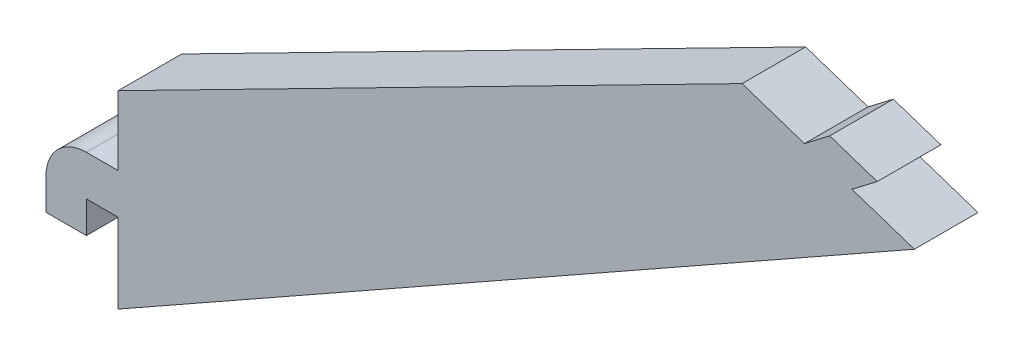
ISO-10303-21;
HEADER;
FILE_DESCRIPTION(('STEP AP214'),'2;1');
FILE_NAME('part.step','',(''),(''),'','','');
FILE_SCHEMA(('AUTOMOTIVE_DESIGN { 1 0 10303 214 1 1 1 1 }'));
ENDSEC;
DATA;
#1=APPLICATION_CONTEXT('core data for automotive mechanical design processes');
#2=APPLICATION_PROTOCOL_DEFINITION('international standard','automotive_design',2000,#1);
#3=PRODUCT_CONTEXT('',#1,'mechanical');
#4=PRODUCT('Part','Part','',(#3));
#5=PRODUCT_RELATED_PRODUCT_CATEGORY('part','',(#4));
#6=PRODUCT_DEFINITION_FORMATION('','',#4);
#7=PRODUCT_DEFINITION_CONTEXT('part definition',#1,'design');
#8=PRODUCT_DEFINITION('design','',#6,#7);
#9=PRODUCT_DEFINITION_SHAPE('','',#8);
#10=(LENGTH_UNIT() NAMED_UNIT(*) SI_UNIT(.MILLI.,.METRE.));
#11=(NAMED_UNIT(*) PLANE_ANGLE_UNIT() SI_UNIT($,.RADIAN.));
#12=(NAMED_UNIT(*) SI_UNIT($,.STERADIAN.) SOLID_ANGLE_UNIT());
#13=UNCERTAINTY_MEASURE_WITH_UNIT(LENGTH_MEASURE(1.E-05),#10,'distance_accuracy_value','');
#14=(GEOMETRIC_REPRESENTATION_CONTEXT(3) GLOBAL_UNCERTAINTY_ASSIGNED_CONTEXT((#13)) GLOBAL_UNIT_ASSIGNED_CONTEXT((#10,
#11,#12)) REPRESENTATION_CONTEXT('',''));
#15=CARTESIAN_POINT('',(0.,0.,0.));
#16=DIRECTION('',(0.,0.,1.));
#17=DIRECTION('',(1.,0.,0.));
#18=AXIS2_PLACEMENT_3D('',#15,#16,#17);
#19=CARTESIAN_POINT('',(-65.6226941993977,-4.16341339021471,6.35));
#20=DIRECTION('',(0.,0.,-1.));
#21=DIRECTION('',(-1.,0.,0.));
#22=AXIS2_PLACEMENT_3D('',#19,#20,#21);
#23=CYLINDRICAL_SURFACE('',#22,4.0323008);
#24=CARTESIAN_POINT('',(-65.6226941993977,-4.16341339021471,0.));
#25=DIRECTION('',(0.,0.,1.));
#26=DIRECTION('',(1.,0.,0.));
#27=AXIS2_PLACEMENT_3D('',#24,#25,#26);
#28=CIRCLE('',#27,4.0323008);
#29=CARTESIAN_POINT('',(-69.6549949993977,-4.16341339021471,0.));
#30=VERTEX_POINT('',#29);
#31=CARTESIAN_POINT('',(-65.6226941993978,-0.131112590214706,0.));
#32=VERTEX_POINT('',#31);
#33=EDGE_CURVE('E176',#30,#32,#28,.F.);
#34=ORIENTED_EDGE('',*,*,#33,.F.);
#35=DIRECTION('',(0.,0.,-1.));
#36=VECTOR('',#35,1.);
#37=CARTESIAN_POINT('',(-69.6549949993977,-4.16341339021471,6.35));
#38=LINE('',#37,#36);
#39=CARTESIAN_POINT('',(-69.6549949993977,-4.16341339021471,6.35));
#40=VERTEX_POINT('',#39);
#41=EDGE_CURVE('E11',#40,#30,#38,.T.);
#42=ORIENTED_EDGE('',*,*,#41,.F.);
#43=CARTESIAN_POINT('',(-65.6226941993977,-4.16341339021471,6.35));
#44=DIRECTION('',(0.,0.,1.));
#45=DIRECTION('',(1.,0.,0.));
#46=AXIS2_PLACEMENT_3D('',#43,#44,#45);
#47=CIRCLE('',#46,4.0323008);
#48=CARTESIAN_POINT('',(-65.6226941993978,-0.131112590214706,6.35));
#49=VERTEX_POINT('',#48);
#50=EDGE_CURVE('E216',#40,#49,#47,.F.);
#51=ORIENTED_EDGE('',*,*,#50,.T.);
#52=DIRECTION('',(0.,0.,-1.));
#53=VECTOR('',#52,1.);
#54=CARTESIAN_POINT('',(-65.6226941993978,-0.131112590214706,6.35));
#55=LINE('',#54,#53);
#56=EDGE_CURVE('E57',#49,#32,#55,.T.);
#57=ORIENTED_EDGE('',*,*,#56,.T.);
#58=EDGE_LOOP('',(#34,#42,#51,#57));
#59=FACE_BOUND('',#58,.T.);
#60=ADVANCED_FACE('F41',(#59),#23,.T.);
#61=CARTESIAN_POINT('',(-69.6549949993977,0.,6.35));
#62=DIRECTION('',(-1.,0.,0.));
#63=DIRECTION('',(0.,0.,1.));
#64=AXIS2_PLACEMENT_3D('',#61,#62,#63);
#65=PLANE('',#64);
#66=DIRECTION('',(0.,1.,0.));
#67=VECTOR('',#66,1.);
#68=CARTESIAN_POINT('',(-69.6549949993977,0.,0.));
#69=LINE('',#68,#67);
#70=CARTESIAN_POINT('',(-69.6549949993977,-7.33841339021471,0.));
#71=VERTEX_POINT('',#70);
#72=EDGE_CURVE('E178',#71,#30,#69,.T.);
#73=ORIENTED_EDGE('',*,*,#72,.F.);
#74=DIRECTION('',(0.,0.,-1.));
#75=VECTOR('',#74,1.);
#76=CARTESIAN_POINT('',(-69.6549949993977,-7.33841339021471,6.35));
#77=LINE('',#76,#75);
#78=CARTESIAN_POINT('',(-69.6549949993977,-7.33841339021471,6.35));
#79=VERTEX_POINT('',#78);
#80=EDGE_CURVE('E49',#79,#71,#77,.T.);
#81=ORIENTED_EDGE('',*,*,#80,.F.);
#82=DIRECTION('',(0.,1.,0.));
#83=VECTOR('',#82,1.);
#84=CARTESIAN_POINT('',(-69.6549949993977,0.,6.35));
#85=LINE('',#84,#83);
#86=EDGE_CURVE('E261',#79,#40,#85,.T.);
#87=ORIENTED_EDGE('',*,*,#86,.T.);
#88=ORIENTED_EDGE('',*,*,#41,.T.);
#89=EDGE_LOOP('',(#73,#81,#87,#88));
#90=FACE_BOUND('',#89,.T.);
#91=ADVANCED_FACE('F248',(#90),#65,.T.);
#92=CARTESIAN_POINT('',(0.,-7.33841339021471,6.35));
#93=DIRECTION('',(0.,-1.,0.));
#94=DIRECTION('',(0.,0.,-1.));
#95=AXIS2_PLACEMENT_3D('',#92,#93,#94);
#96=PLANE('',#95);
#97=DIRECTION('',(-1.,0.,0.));
#98=VECTOR('',#97,1.);
#99=CARTESIAN_POINT('',(0.,-7.33841339021471,0.));
#100=LINE('',#99,#98);
#101=CARTESIAN_POINT('',(-65.6226941993977,-7.33841339021471,0.));
#102=VERTEX_POINT('',#101);
#103=EDGE_CURVE('E181',#102,#71,#100,.T.);
#104=ORIENTED_EDGE('',*,*,#103,.F.);
#105=DIRECTION('',(0.,0.,-1.));
#106=VECTOR('',#105,1.);
#107=CARTESIAN_POINT('',(-65.6226941993977,-7.33841339021471,6.35));
#108=LINE('',#107,#106);
#109=CARTESIAN_POINT('',(-65.6226941993977,-7.33841339021471,6.35));
#110=VERTEX_POINT('',#109);
#111=EDGE_CURVE('E237',#110,#102,#108,.T.);
#112=ORIENTED_EDGE('',*,*,#111,.F.);
#113=DIRECTION('',(-1.,0.,0.));
#114=VECTOR('',#113,1.);
#115=CARTESIAN_POINT('',(0.,-7.33841339021471,6.35));
#116=LINE('',#115,#114);
#117=EDGE_CURVE('E244',#110,#79,#116,.T.);
#118=ORIENTED_EDGE('',*,*,#117,.T.);
#119=ORIENTED_EDGE('',*,*,#80,.T.);
#120=EDGE_LOOP('',(#104,#112,#118,#119));
#121=FACE_BOUND('',#120,.T.);
#122=ADVANCED_FACE('F242',(#121),#96,.T.);
#123=CARTESIAN_POINT('',(-65.6226941993977,0.,6.35));
#124=DIRECTION('',(1.,0.,0.));
#125=DIRECTION('',(0.,0.,-1.));
#126=AXIS2_PLACEMENT_3D('',#123,#124,#125);
#127=PLANE('',#126);
#128=DIRECTION('',(0.,-1.,0.));
#129=VECTOR('',#128,1.);
#130=CARTESIAN_POINT('',(-65.6226941993977,0.,0.));
#131=LINE('',#130,#129);
#132=CARTESIAN_POINT('',(-65.6226941993977,-4.16341339021471,0.));
#133=VERTEX_POINT('',#132);
#134=EDGE_CURVE('E184',#133,#102,#131,.T.);
#135=ORIENTED_EDGE('',*,*,#134,.F.);
#136=DIRECTION('',(0.,0.,-1.));
#137=VECTOR('',#136,1.);
#138=CARTESIAN_POINT('',(-65.6226941993977,-4.16341339021471,6.35));
#139=LINE('',#138,#137);
#140=CARTESIAN_POINT('',(-65.6226941993977,-4.16341339021471,6.35));
#141=VERTEX_POINT('',#140);
#142=EDGE_CURVE('E235',#141,#133,#139,.T.);
#143=ORIENTED_EDGE('',*,*,#142,.F.);
#144=DIRECTION('',(0.,-1.,0.));
#145=VECTOR('',#144,1.);
#146=CARTESIAN_POINT('',(-65.6226941993977,0.,6.35));
#147=LINE('',#146,#145);
#148=EDGE_CURVE('E258',#141,#110,#147,.T.);
#149=ORIENTED_EDGE('',*,*,#148,.T.);
#150=ORIENTED_EDGE('',*,*,#111,.T.);
#151=EDGE_LOOP('',(#135,#143,#149,#150));
#152=FACE_BOUND('',#151,.T.);
#153=ADVANCED_FACE('F255',(#152),#127,.T.);
#154=CARTESIAN_POINT('',(0.,-4.16341339021471,6.35));
#155=DIRECTION('',(0.,-1.,0.));
#156=DIRECTION('',(0.,0.,-1.));
#157=AXIS2_PLACEMENT_3D('',#154,#155,#156);
#158=PLANE('',#157);
#159=DIRECTION('',(-1.,0.,0.));
#160=VECTOR('',#159,1.);
#161=CARTESIAN_POINT('',(0.,-4.16341339021471,0.));
#162=LINE('',#161,#160);
#163=CARTESIAN_POINT('',(-62.4476941993978,-4.16341339021471,0.));
#164=VERTEX_POINT('',#163);
#165=EDGE_CURVE('E187',#164,#133,#162,.T.);
#166=ORIENTED_EDGE('',*,*,#165,.F.);
#167=DIRECTION('',(0.,0.,-1.));
#168=VECTOR('',#167,1.);
#169=CARTESIAN_POINT('',(-62.4476941993978,-4.16341339021471,6.35));
#170=LINE('',#169,#168);
#171=CARTESIAN_POINT('',(-62.4476941993978,-4.16341339021471,6.35));
#172=VERTEX_POINT('',#171);
#173=EDGE_CURVE('E233',#172,#164,#170,.T.);
#174=ORIENTED_EDGE('',*,*,#173,.F.);
#175=DIRECTION('',(-1.,0.,0.));
#176=VECTOR('',#175,1.);
#177=CARTESIAN_POINT('',(0.,-4.16341339021471,6.35));
#178=LINE('',#177,#176);
#179=EDGE_CURVE('E263',#172,#141,#178,.T.);
#180=ORIENTED_EDGE('',*,*,#179,.T.);
#181=ORIENTED_EDGE('',*,*,#142,.T.);
#182=EDGE_LOOP('',(#166,#174,#180,#181));
#183=FACE_BOUND('',#182,.T.);
#184=ADVANCED_FACE('F309',(#183),#158,.T.);
#185=CARTESIAN_POINT('',(-62.4476941993978,0.,6.35));
#186=DIRECTION('',(1.,0.,0.));
#187=DIRECTION('',(0.,0.,-1.));
#188=AXIS2_PLACEMENT_3D('',#185,#186,#187);
#189=PLANE('',#188);
#190=DIRECTION('',(0.,-1.,0.));
#191=VECTOR('',#190,1.);
#192=CARTESIAN_POINT('',(-62.4476941993978,0.,0.));
#193=LINE('',#192,#191);
#194=CARTESIAN_POINT('',(-62.4476941993978,-12.1077047697668,0.));
#195=VERTEX_POINT('',#194);
#196=EDGE_CURVE('E190',#164,#195,#193,.T.);
#197=ORIENTED_EDGE('',*,*,#196,.T.);
#198=DIRECTION('',(0.,0.,-1.));
#199=VECTOR('',#198,1.);
#200=CARTESIAN_POINT('',(-62.4476941993978,-12.1077047697668,6.35));
#201=LINE('',#200,#199);
#202=CARTESIAN_POINT('',(-62.4476941993978,-12.1077047697668,6.35));
#203=VERTEX_POINT('',#202);
#204=EDGE_CURVE('E230',#203,#195,#201,.T.);
#205=ORIENTED_EDGE('',*,*,#204,.F.);
#206=DIRECTION('',(0.,-1.,0.));
#207=VECTOR('',#206,1.);
#208=CARTESIAN_POINT('',(-62.4476941993978,0.,6.35));
#209=LINE('',#208,#207);
#210=EDGE_CURVE('E269',#172,#203,#209,.T.);
#211=ORIENTED_EDGE('',*,*,#210,.F.);
#212=ORIENTED_EDGE('',*,*,#173,.T.);
#213=EDGE_LOOP('',(#197,#205,#211,#212));
#214=FACE_BOUND('',#213,.T.);
#215=ADVANCED_FACE('F312',(#214),#189,.F.);
#216=CARTESIAN_POINT('',(-9.92920066728216,17.5706219949138,6.35));
#217=DIRECTION('',(-0.491981382202654,0.870605719924907,0.));
#218=DIRECTION('',(-0.870605719924907,-0.491981382202654,0.));
#219=AXIS2_PLACEMENT_3D('',#216,#217,#218);
#220=PLANE('',#219);
#221=DIRECTION('',(0.870605719924907,0.491981382202654,0.));
#222=VECTOR('',#221,1.);
#223=CARTESIAN_POINT('',(-9.92920066728216,17.5706219949138,0.));
#224=LINE('',#223,#222);
#225=CARTESIAN_POINT('',(17.0563587289375,32.8202263880588,0.));
#226=VERTEX_POINT('',#225);
#227=EDGE_CURVE('E192',#195,#226,#224,.T.);
#228=ORIENTED_EDGE('',*,*,#227,.T.);
#229=DIRECTION('',(0.,0.,-1.));
#230=VECTOR('',#229,1.);
#231=CARTESIAN_POINT('',(17.0563587289375,32.8202263880588,6.35));
#232=LINE('',#231,#230);
#233=CARTESIAN_POINT('',(17.0563587289375,32.8202263880588,6.35));
#234=VERTEX_POINT('',#233);
#235=EDGE_CURVE('E228',#234,#226,#232,.T.);
#236=ORIENTED_EDGE('',*,*,#235,.F.);
#237=DIRECTION('',(0.870605719924907,0.491981382202654,0.));
#238=VECTOR('',#237,1.);
#239=CARTESIAN_POINT('',(-9.92920066728216,17.5706219949138,6.35));
#240=LINE('',#239,#238);
#241=EDGE_CURVE('E271',#203,#234,#240,.T.);
#242=ORIENTED_EDGE('',*,*,#241,.F.);
#243=ORIENTED_EDGE('',*,*,#204,.T.);
#244=EDGE_LOOP('',(#228,#236,#242,#243));
#245=FACE_BOUND('',#244,.T.);
#246=ADVANCED_FACE('F316',(#245),#220,.F.);
#247=CARTESIAN_POINT('',(11.523536235453,34.6597569036708,6.35));
#248=DIRECTION('',(0.31549545255864,0.94892708856625,0.));
#249=DIRECTION('',(-0.94892708856625,0.31549545255864,0.));
#250=AXIS2_PLACEMENT_3D('',#247,#248,#249);
#251=PLANE('',#250);
#252=DIRECTION('',(0.94892708856625,-0.31549545255864,0.));
#253=VECTOR('',#252,1.);
#254=CARTESIAN_POINT('',(11.523536235453,34.6597569036708,0.));
#255=LINE('',#254,#253);
#256=CARTESIAN_POINT('',(10.8255546057863,34.8918190218068,0.));
#257=VERTEX_POINT('',#256);
#258=EDGE_CURVE('E195',#257,#226,#255,.T.);
#259=ORIENTED_EDGE('',*,*,#258,.F.);
#260=DIRECTION('',(0.,0.,-1.));
#261=VECTOR('',#260,1.);
#262=CARTESIAN_POINT('',(10.8255546057863,34.8918190218068,6.35));
#263=LINE('',#262,#261);
#264=CARTESIAN_POINT('',(10.8255546057863,34.8918190218068,6.35));
#265=VERTEX_POINT('',#264);
#266=EDGE_CURVE('E226',#265,#257,#263,.T.);
#267=ORIENTED_EDGE('',*,*,#266,.F.);
#268=DIRECTION('',(0.94892708856625,-0.31549545255864,0.));
#269=VECTOR('',#268,1.);
#270=CARTESIAN_POINT('',(11.523536235453,34.6597569036708,6.35));
#271=LINE('',#270,#269);
#272=EDGE_CURVE('E273',#265,#234,#271,.T.);
#273=ORIENTED_EDGE('',*,*,#272,.T.);
#274=ORIENTED_EDGE('',*,*,#235,.T.);
#275=EDGE_LOOP('',(#259,#267,#273,#274));
#276=FACE_BOUND('',#275,.T.);
#277=ADVANCED_FACE('F320',(#276),#251,.T.);
#278=CARTESIAN_POINT('',(-12.8413695559847,16.7795468109685,6.35));
#279=DIRECTION('',(0.607747251155393,-0.794130517429638,0.));
#280=DIRECTION('',(0.794130517429638,0.607747251155393,0.));
#281=AXIS2_PLACEMENT_3D('',#278,#279,#280);
#282=PLANE('',#281);
#283=DIRECTION('',(-0.794130517429638,-0.607747251155393,0.));
#284=VECTOR('',#283,1.);
#285=CARTESIAN_POINT('',(-12.8413695559847,16.7795468109685,0.));
#286=LINE('',#285,#284);
#287=CARTESIAN_POINT('',(13.3469189986254,36.8214165442252,0.));
#288=VERTEX_POINT('',#287);
#289=EDGE_CURVE('E198',#288,#257,#286,.T.);
#290=ORIENTED_EDGE('',*,*,#289,.F.);
#291=DIRECTION('',(0.,0.,-1.));
#292=VECTOR('',#291,1.);
#293=CARTESIAN_POINT('',(13.3469189986254,36.8214165442252,6.35));
#294=LINE('',#293,#292);
#295=CARTESIAN_POINT('',(13.3469189986254,36.8214165442252,6.35));
#296=VERTEX_POINT('',#295);
#297=EDGE_CURVE('E224',#296,#288,#294,.T.);
#298=ORIENTED_EDGE('',*,*,#297,.F.);
#299=DIRECTION('',(-0.794130517429638,-0.607747251155393,0.));
#300=VECTOR('',#299,1.);
#301=CARTESIAN_POINT('',(-12.8413695559847,16.7795468109685,6.35));
#302=LINE('',#301,#300);
#303=EDGE_CURVE('E276',#296,#265,#302,.T.);
#304=ORIENTED_EDGE('',*,*,#303,.T.);
#305=ORIENTED_EDGE('',*,*,#266,.T.);
#306=EDGE_LOOP('',(#290,#298,#304,#305));
#307=FACE_BOUND('',#306,.T.);
#308=ADVANCED_FACE('F324',(#307),#282,.T.);
#309=CARTESIAN_POINT('',(12.3521933578177,37.1521389147842,6.35));
#310=DIRECTION('',(0.315495452558639,0.94892708856625,0.));
#311=DIRECTION('',(-0.94892708856625,0.315495452558639,0.));
#312=AXIS2_PLACEMENT_3D('',#309,#310,#311);
#313=PLANE('',#312);
#314=DIRECTION('',(0.94892708856625,-0.315495452558639,0.));
#315=VECTOR('',#314,1.);
#316=CARTESIAN_POINT('',(12.3521933578177,37.1521389147842,0.));
#317=LINE('',#316,#315);
#318=CARTESIAN_POINT('',(8.6022835557941,38.3988938070184,0.));
#319=VERTEX_POINT('',#318);
#320=EDGE_CURVE('E201',#319,#288,#317,.T.);
#321=ORIENTED_EDGE('',*,*,#320,.F.);
#322=DIRECTION('',(0.,0.,-1.));
#323=VECTOR('',#322,1.);
#324=CARTESIAN_POINT('',(8.6022835557941,38.3988938070184,6.35));
#325=LINE('',#324,#323);
#326=CARTESIAN_POINT('',(8.6022835557941,38.3988938070184,6.35));
#327=VERTEX_POINT('',#326);
#328=EDGE_CURVE('E222',#327,#319,#325,.T.);
#329=ORIENTED_EDGE('',*,*,#328,.F.);
#330=DIRECTION('',(0.94892708856625,-0.315495452558639,0.));
#331=VECTOR('',#330,1.);
#332=CARTESIAN_POINT('',(12.3521933578177,37.1521389147842,6.35));
#333=LINE('',#332,#331);
#334=EDGE_CURVE('E279',#327,#296,#333,.T.);
#335=ORIENTED_EDGE('',*,*,#334,.T.);
#336=ORIENTED_EDGE('',*,*,#297,.T.);
#337=EDGE_LOOP('',(#321,#329,#335,#336));
#338=FACE_BOUND('',#337,.T.);
#339=ADVANCED_FACE('F328',(#338),#313,.T.);
#340=CARTESIAN_POINT('',(-15.3551714062423,20.064278679793,6.35));
#341=DIRECTION('',(-0.607747251155393,0.794130517429637,0.));
#342=DIRECTION('',(-0.794130517429637,-0.607747251155394,0.));
#343=AXIS2_PLACEMENT_3D('',#340,#341,#342);
#344=PLANE('',#343);
#345=DIRECTION('',(0.794130517429637,0.607747251155394,0.));
#346=VECTOR('',#345,1.);
#347=CARTESIAN_POINT('',(-15.3551714062423,20.064278679793,0.));
#348=LINE('',#347,#346);
#349=CARTESIAN_POINT('',(6.08091916295501,36.4692962846,0.));
#350=VERTEX_POINT('',#349);
#351=EDGE_CURVE('E204',#350,#319,#348,.T.);
#352=ORIENTED_EDGE('',*,*,#351,.F.);
#353=DIRECTION('',(0.,0.,-1.));
#354=VECTOR('',#353,1.);
#355=CARTESIAN_POINT('',(6.08091916295501,36.4692962846,6.35));
#356=LINE('',#355,#354);
#357=CARTESIAN_POINT('',(6.08091916295501,36.4692962846,6.35));
#358=VERTEX_POINT('',#357);
#359=EDGE_CURVE('E220',#358,#350,#356,.T.);
#360=ORIENTED_EDGE('',*,*,#359,.F.);
#361=DIRECTION('',(0.794130517429637,0.607747251155394,0.));
#362=VECTOR('',#361,1.);
#363=CARTESIAN_POINT('',(-15.3551714062423,20.064278679793,6.35));
#364=LINE('',#363,#362);
#365=EDGE_CURVE('E282',#358,#327,#364,.T.);
#366=ORIENTED_EDGE('',*,*,#365,.T.);
#367=ORIENTED_EDGE('',*,*,#328,.T.);
#368=EDGE_LOOP('',(#352,#360,#366,#367));
#369=FACE_BOUND('',#368,.T.);
#370=ADVANCED_FACE('F332',(#369),#344,.T.);
#371=CARTESIAN_POINT('',(11.5235362354529,34.6597569036708,6.35));
#372=DIRECTION('',(0.315495452558639,0.94892708856625,0.));
#373=DIRECTION('',(-0.94892708856625,0.315495452558639,0.));
#374=AXIS2_PLACEMENT_3D('',#371,#372,#373);
#375=PLANE('',#374);
#376=DIRECTION('',(0.94892708856625,-0.315495452558639,0.));
#377=VECTOR('',#376,1.);
#378=CARTESIAN_POINT('',(11.5235362354529,34.6597569036708,0.));
#379=LINE('',#378,#377);
#380=CARTESIAN_POINT('',(-0.149884960196269,38.5408889183481,0.));
#381=VERTEX_POINT('',#380);
#382=EDGE_CURVE('E207',#381,#350,#379,.T.);
#383=ORIENTED_EDGE('',*,*,#382,.F.);
#384=DIRECTION('',(0.,0.,-1.));
#385=VECTOR('',#384,1.);
#386=CARTESIAN_POINT('',(-0.149884960196269,38.5408889183481,6.35));
#387=LINE('',#386,#385);
#388=CARTESIAN_POINT('',(-0.149884960196269,38.5408889183481,6.35));
#389=VERTEX_POINT('',#388);
#390=EDGE_CURVE('E168',#389,#381,#387,.T.);
#391=ORIENTED_EDGE('',*,*,#390,.F.);
#392=DIRECTION('',(0.94892708856625,-0.315495452558639,0.));
#393=VECTOR('',#392,1.);
#394=CARTESIAN_POINT('',(11.5235362354529,34.6597569036708,6.35));
#395=LINE('',#394,#393);
#396=EDGE_CURVE('E158',#389,#358,#395,.T.);
#397=ORIENTED_EDGE('',*,*,#396,.T.);
#398=ORIENTED_EDGE('',*,*,#359,.T.);
#399=EDGE_LOOP('',(#383,#391,#397,#398));
#400=FACE_BOUND('',#399,.T.);
#401=ADVANCED_FACE('F286',(#400),#375,.T.);
#402=CARTESIAN_POINT('',(-15.626142002394,30.6509470599901,6.35));
#403=DIRECTION('',(0.454191346098469,-0.890904159339971,0.));
#404=DIRECTION('',(0.890904159339971,0.454191346098469,0.));
#405=AXIS2_PLACEMENT_3D('',#402,#403,#404);
#406=PLANE('',#405);
#407=DIRECTION('',(-0.890904159339971,-0.454191346098469,0.));
#408=VECTOR('',#407,1.);
#409=CARTESIAN_POINT('',(-15.626142002394,30.6509470599901,0.));
#410=LINE('',#409,#408);
#411=CARTESIAN_POINT('',(-62.4476941993978,6.78087798933742,0.));
#412=VERTEX_POINT('',#411);
#413=EDGE_CURVE('E165',#381,#412,#410,.T.);
#414=ORIENTED_EDGE('',*,*,#413,.T.);
#415=DIRECTION('',(0.,0.,-1.));
#416=VECTOR('',#415,1.);
#417=CARTESIAN_POINT('',(-62.4476941993978,6.78087798933742,6.35));
#418=LINE('',#417,#416);
#419=CARTESIAN_POINT('',(-62.4476941993978,6.78087798933742,6.35));
#420=VERTEX_POINT('',#419);
#421=EDGE_CURVE('E162',#420,#412,#418,.T.);
#422=ORIENTED_EDGE('',*,*,#421,.F.);
#423=DIRECTION('',(-0.890904159339971,-0.454191346098469,0.));
#424=VECTOR('',#423,1.);
#425=CARTESIAN_POINT('',(-15.626142002394,30.6509470599901,6.35));
#426=LINE('',#425,#424);
#427=EDGE_CURVE('E150',#389,#420,#426,.T.);
#428=ORIENTED_EDGE('',*,*,#427,.F.);
#429=ORIENTED_EDGE('',*,*,#390,.T.);
#430=EDGE_LOOP('',(#414,#422,#428,#429));
#431=FACE_BOUND('',#430,.T.);
#432=ADVANCED_FACE('F163',(#431),#406,.F.);
#433=CARTESIAN_POINT('',(-62.4476941993978,0.,6.35));
#434=DIRECTION('',(1.,0.,0.));
#435=DIRECTION('',(0.,0.,-1.));
#436=AXIS2_PLACEMENT_3D('',#433,#434,#435);
#437=PLANE('',#436);
#438=DIRECTION('',(0.,-1.,0.));
#439=VECTOR('',#438,1.);
#440=CARTESIAN_POINT('',(-62.4476941993978,0.,0.));
#441=LINE('',#440,#439);
#442=CARTESIAN_POINT('',(-62.4476941993978,-0.131112590214706,0.));
#443=VERTEX_POINT('',#442);
#444=EDGE_CURVE('E211',#412,#443,#441,.T.);
#445=ORIENTED_EDGE('',*,*,#444,.T.);
#446=DIRECTION('',(0.,0.,-1.));
#447=VECTOR('',#446,1.);
#448=CARTESIAN_POINT('',(-62.4476941993978,-0.131112590214706,6.35));
#449=LINE('',#448,#447);
#450=CARTESIAN_POINT('',(-62.4476941993978,-0.131112590214706,6.35));
#451=VERTEX_POINT('',#450);
#452=EDGE_CURVE('E104',#451,#443,#449,.T.);
#453=ORIENTED_EDGE('',*,*,#452,.F.);
#454=DIRECTION('',(0.,-1.,0.));
#455=VECTOR('',#454,1.);
#456=CARTESIAN_POINT('',(-62.4476941993978,0.,6.35));
#457=LINE('',#456,#455);
#458=EDGE_CURVE('E155',#420,#451,#457,.T.);
#459=ORIENTED_EDGE('',*,*,#458,.F.);
#460=ORIENTED_EDGE('',*,*,#421,.T.);
#461=EDGE_LOOP('',(#445,#453,#459,#460));
#462=FACE_BOUND('',#461,.T.);
#463=ADVANCED_FACE('F170',(#462),#437,.F.);
#464=CARTESIAN_POINT('',(0.,-0.131112590214706,6.35));
#465=DIRECTION('',(0.,1.,0.));
#466=DIRECTION('',(0.,0.,1.));
#467=AXIS2_PLACEMENT_3D('',#464,#465,#466);
#468=PLANE('',#467);
#469=DIRECTION('',(1.,0.,0.));
#470=VECTOR('',#469,1.);
#471=CARTESIAN_POINT('',(0.,-0.131112590214706,0.));
#472=LINE('',#471,#470);
#473=EDGE_CURVE('E213',#32,#443,#472,.T.);
#474=ORIENTED_EDGE('',*,*,#473,.F.);
#475=ORIENTED_EDGE('',*,*,#56,.F.);
#476=DIRECTION('',(1.,0.,0.));
#477=VECTOR('',#476,1.);
#478=CARTESIAN_POINT('',(0.,-0.131112590214706,6.35));
#479=LINE('',#478,#477);
#480=EDGE_CURVE('E171',#49,#451,#479,.T.);
#481=ORIENTED_EDGE('',*,*,#480,.T.);
#482=ORIENTED_EDGE('',*,*,#452,.T.);
#483=EDGE_LOOP('',(#474,#475,#481,#482));
#484=FACE_BOUND('',#483,.T.);
#485=ADVANCED_FACE('F288',(#484),#468,.T.);
#486=CARTESIAN_POINT('',(0.,0.,6.35));
#487=DIRECTION('',(0.,0.,1.));
#488=DIRECTION('',(1.,0.,0.));
#489=AXIS2_PLACEMENT_3D('',#486,#487,#488);
#490=PLANE('',#489);
#491=ORIENTED_EDGE('',*,*,#50,.F.);
#492=ORIENTED_EDGE('',*,*,#86,.F.);
#493=ORIENTED_EDGE('',*,*,#117,.F.);
#494=ORIENTED_EDGE('',*,*,#148,.F.);
#495=ORIENTED_EDGE('',*,*,#179,.F.);
#496=ORIENTED_EDGE('',*,*,#210,.T.);
#497=ORIENTED_EDGE('',*,*,#241,.T.);
#498=ORIENTED_EDGE('',*,*,#272,.F.);
#499=ORIENTED_EDGE('',*,*,#303,.F.);
#500=ORIENTED_EDGE('',*,*,#334,.F.);
#501=ORIENTED_EDGE('',*,*,#365,.F.);
#502=ORIENTED_EDGE('',*,*,#396,.F.);
#503=ORIENTED_EDGE('',*,*,#427,.T.);
#504=ORIENTED_EDGE('',*,*,#458,.T.);
#505=ORIENTED_EDGE('',*,*,#480,.F.);
#506=EDGE_LOOP('',(#491,#492,#493,#494,#495,#496,#497,#498,#499,#500,#501,#502,#503,#504,#505));
#507=FACE_BOUND('',#506,.T.);
#508=ADVANCED_FACE('F152',(#507),#490,.T.);
#509=CARTESIAN_POINT('',(0.,0.,0.));
#510=DIRECTION('',(0.,0.,1.));
#511=DIRECTION('',(1.,0.,0.));
#512=AXIS2_PLACEMENT_3D('',#509,#510,#511);
#513=PLANE('',#512);
#514=ORIENTED_EDGE('',*,*,#33,.T.);
#515=ORIENTED_EDGE('',*,*,#473,.T.);
#516=ORIENTED_EDGE('',*,*,#444,.F.);
#517=ORIENTED_EDGE('',*,*,#413,.F.);
#518=ORIENTED_EDGE('',*,*,#382,.T.);
#519=ORIENTED_EDGE('',*,*,#351,.T.);
#520=ORIENTED_EDGE('',*,*,#320,.T.);
#521=ORIENTED_EDGE('',*,*,#289,.T.);
#522=ORIENTED_EDGE('',*,*,#258,.T.);
#523=ORIENTED_EDGE('',*,*,#227,.F.);
#524=ORIENTED_EDGE('',*,*,#196,.F.);
#525=ORIENTED_EDGE('',*,*,#165,.T.);
#526=ORIENTED_EDGE('',*,*,#134,.T.);
#527=ORIENTED_EDGE('',*,*,#103,.T.);
#528=ORIENTED_EDGE('',*,*,#72,.T.);
#529=EDGE_LOOP('',(#514,#515,#516,#517,#518,#519,#520,#521,#522,#523,#524,#525,#526,#527,#528));
#530=FACE_BOUND('',#529,.T.);
#531=ADVANCED_FACE('F250',(#530),#513,.F.);
#532=CLOSED_SHELL('',(#60,#91,#122,#153,#184,#215,#246,#277,#308,#339,#370,#401,#432,#463,#485,
#508,#531));
#533=MANIFOLD_SOLID_BREP('B2',#532);
#534=ADVANCED_BREP_SHAPE_REPRESENTATION('',(#18,#533),#14);
#535=SHAPE_DEFINITION_REPRESENTATION(#9,#534);
ENDSEC;
END-ISO-10303-21;
